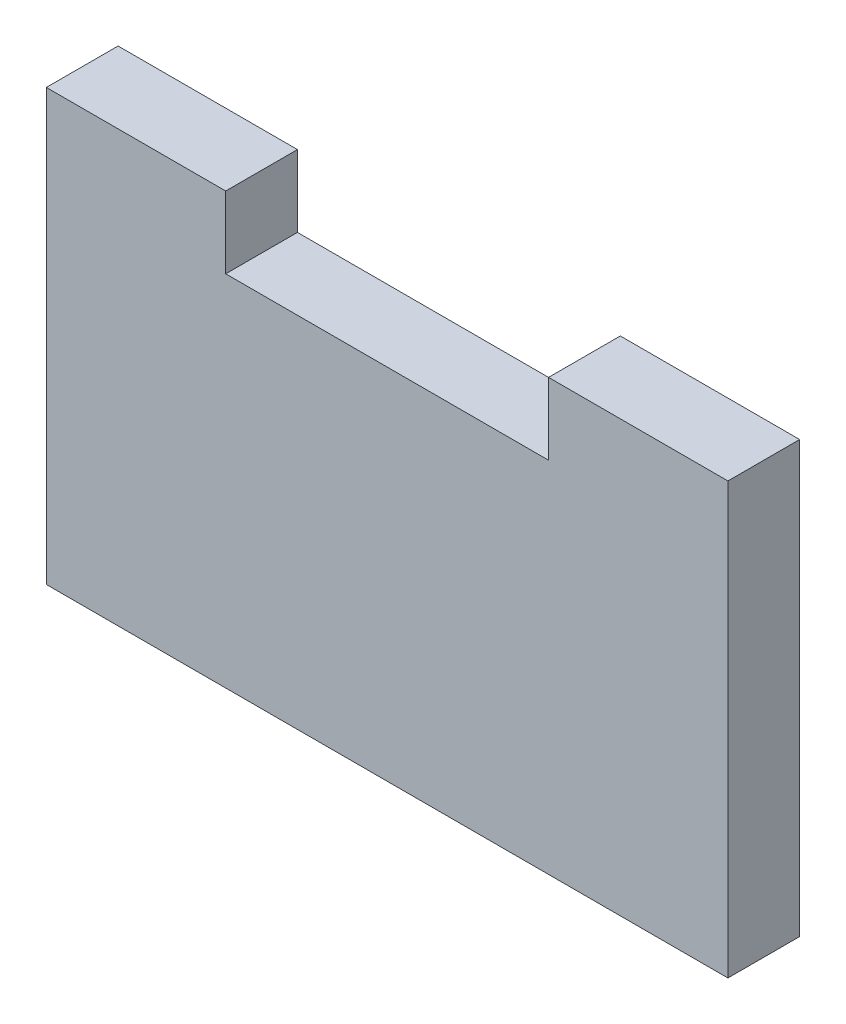
ISO-10303-21;
HEADER;
FILE_DESCRIPTION(('STEP AP214'),'2;1');
FILE_NAME('part.step','',(''),(''),'','','');
FILE_SCHEMA(('AUTOMOTIVE_DESIGN { 1 0 10303 214 1 1 1 1 }'));
ENDSEC;
DATA;
#1=APPLICATION_CONTEXT('core data for automotive mechanical design processes');
#2=APPLICATION_PROTOCOL_DEFINITION('international standard','automotive_design',2000,#1);
#3=PRODUCT_CONTEXT('',#1,'mechanical');
#4=PRODUCT('Part','Part','',(#3));
#5=PRODUCT_RELATED_PRODUCT_CATEGORY('part','',(#4));
#6=PRODUCT_DEFINITION_FORMATION('','',#4);
#7=PRODUCT_DEFINITION_CONTEXT('part definition',#1,'design');
#8=PRODUCT_DEFINITION('design','',#6,#7);
#9=PRODUCT_DEFINITION_SHAPE('','',#8);
#10=(LENGTH_UNIT() NAMED_UNIT(*) SI_UNIT(.MILLI.,.METRE.));
#11=(NAMED_UNIT(*) PLANE_ANGLE_UNIT() SI_UNIT($,.RADIAN.));
#12=(NAMED_UNIT(*) SI_UNIT($,.STERADIAN.) SOLID_ANGLE_UNIT());
#13=UNCERTAINTY_MEASURE_WITH_UNIT(LENGTH_MEASURE(1.E-05),#10,'distance_accuracy_value','');
#14=(GEOMETRIC_REPRESENTATION_CONTEXT(3) GLOBAL_UNCERTAINTY_ASSIGNED_CONTEXT((#13)) GLOBAL_UNIT_ASSIGNED_CONTEXT((#10,
#11,#12)) REPRESENTATION_CONTEXT('',''));
#15=CARTESIAN_POINT('',(0.,0.,0.));
#16=DIRECTION('',(0.,0.,1.));
#17=DIRECTION('',(1.,0.,0.));
#18=AXIS2_PLACEMENT_3D('',#15,#16,#17);
#19=CARTESIAN_POINT('',(9.,14.,4.));
#20=DIRECTION('',(0.,-1.,0.));
#21=DIRECTION('',(0.,0.,-1.));
#22=AXIS2_PLACEMENT_3D('',#19,#20,#21);
#23=PLANE('',#22);
#24=DIRECTION('',(-1.,0.,0.));
#25=VECTOR('',#24,1.);
#26=CARTESIAN_POINT('',(9.,14.,0.));
#27=LINE('',#26,#25);
#28=CARTESIAN_POINT('',(19.,14.,0.));
#29=VERTEX_POINT('',#28);
#30=CARTESIAN_POINT('',(9.,14.,0.));
#31=VERTEX_POINT('',#30);
#32=EDGE_CURVE('E133',#29,#31,#27,.T.);
#33=ORIENTED_EDGE('',*,*,#32,.T.);
#34=DIRECTION('',(0.,0.,-1.));
#35=VECTOR('',#34,1.);
#36=CARTESIAN_POINT('',(9.,14.,4.));
#37=LINE('',#36,#35);
#38=CARTESIAN_POINT('',(9.,14.,4.));
#39=VERTEX_POINT('',#38);
#40=EDGE_CURVE('E41',#39,#31,#37,.T.);
#41=ORIENTED_EDGE('',*,*,#40,.F.);
#42=DIRECTION('',(-1.,0.,0.));
#43=VECTOR('',#42,1.);
#44=CARTESIAN_POINT('',(9.,14.,4.));
#45=LINE('',#44,#43);
#46=CARTESIAN_POINT('',(19.,14.,4.));
#47=VERTEX_POINT('',#46);
#48=EDGE_CURVE('E92',#47,#39,#45,.T.);
#49=ORIENTED_EDGE('',*,*,#48,.F.);
#50=DIRECTION('',(0.,0.,-1.));
#51=VECTOR('',#50,1.);
#52=CARTESIAN_POINT('',(19.,14.,4.));
#53=LINE('',#52,#51);
#54=EDGE_CURVE('E11',#47,#29,#53,.T.);
#55=ORIENTED_EDGE('',*,*,#54,.T.);
#56=EDGE_LOOP('',(#33,#41,#49,#55));
#57=FACE_BOUND('',#56,.T.);
#58=ADVANCED_FACE('F33',(#57),#23,.F.);
#59=CARTESIAN_POINT('',(9.,10.,4.));
#60=DIRECTION('',(1.,0.,0.));
#61=DIRECTION('',(0.,0.,-1.));
#62=AXIS2_PLACEMENT_3D('',#59,#60,#61);
#63=PLANE('',#62);
#64=DIRECTION('',(0.,-1.,0.));
#65=VECTOR('',#64,1.);
#66=CARTESIAN_POINT('',(9.,10.,0.));
#67=LINE('',#66,#65);
#68=CARTESIAN_POINT('',(9.,10.,0.));
#69=VERTEX_POINT('',#68);
#70=EDGE_CURVE('E135',#31,#69,#67,.T.);
#71=ORIENTED_EDGE('',*,*,#70,.T.);
#72=DIRECTION('',(0.,0.,-1.));
#73=VECTOR('',#72,1.);
#74=CARTESIAN_POINT('',(9.,10.,4.));
#75=LINE('',#74,#73);
#76=CARTESIAN_POINT('',(9.,10.,4.));
#77=VERTEX_POINT('',#76);
#78=EDGE_CURVE('E152',#77,#69,#75,.T.);
#79=ORIENTED_EDGE('',*,*,#78,.F.);
#80=DIRECTION('',(0.,-1.,0.));
#81=VECTOR('',#80,1.);
#82=CARTESIAN_POINT('',(9.,10.,4.));
#83=LINE('',#82,#81);
#84=EDGE_CURVE('E160',#39,#77,#83,.T.);
#85=ORIENTED_EDGE('',*,*,#84,.F.);
#86=ORIENTED_EDGE('',*,*,#40,.T.);
#87=EDGE_LOOP('',(#71,#79,#85,#86));
#88=FACE_BOUND('',#87,.T.);
#89=ADVANCED_FACE('F158',(#88),#63,.F.);
#90=CARTESIAN_POINT('',(-9.,10.,4.));
#91=DIRECTION('',(0.,-1.,0.));
#92=DIRECTION('',(0.,0.,-1.));
#93=AXIS2_PLACEMENT_3D('',#90,#91,#92);
#94=PLANE('',#93);
#95=DIRECTION('',(-1.,0.,0.));
#96=VECTOR('',#95,1.);
#97=CARTESIAN_POINT('',(-9.,10.,0.));
#98=LINE('',#97,#96);
#99=CARTESIAN_POINT('',(-9.,10.,0.));
#100=VERTEX_POINT('',#99);
#101=EDGE_CURVE('E137',#69,#100,#98,.T.);
#102=ORIENTED_EDGE('',*,*,#101,.T.);
#103=DIRECTION('',(0.,0.,-1.));
#104=VECTOR('',#103,1.);
#105=CARTESIAN_POINT('',(-9.,10.,4.));
#106=LINE('',#105,#104);
#107=CARTESIAN_POINT('',(-9.,10.,4.));
#108=VERTEX_POINT('',#107);
#109=EDGE_CURVE('E149',#108,#100,#106,.T.);
#110=ORIENTED_EDGE('',*,*,#109,.F.);
#111=DIRECTION('',(-1.,0.,0.));
#112=VECTOR('',#111,1.);
#113=CARTESIAN_POINT('',(-9.,10.,4.));
#114=LINE('',#113,#112);
#115=EDGE_CURVE('E173',#77,#108,#114,.T.);
#116=ORIENTED_EDGE('',*,*,#115,.F.);
#117=ORIENTED_EDGE('',*,*,#78,.T.);
#118=EDGE_LOOP('',(#102,#110,#116,#117));
#119=FACE_BOUND('',#118,.T.);
#120=ADVANCED_FACE('F169',(#119),#94,.F.);
#121=CARTESIAN_POINT('',(-9.,14.,4.));
#122=DIRECTION('',(-1.,0.,0.));
#123=DIRECTION('',(0.,0.,1.));
#124=AXIS2_PLACEMENT_3D('',#121,#122,#123);
#125=PLANE('',#124);
#126=DIRECTION('',(0.,1.,0.));
#127=VECTOR('',#126,1.);
#128=CARTESIAN_POINT('',(-9.,14.,0.));
#129=LINE('',#128,#127);
#130=CARTESIAN_POINT('',(-9.,14.,0.));
#131=VERTEX_POINT('',#130);
#132=EDGE_CURVE('E139',#100,#131,#129,.T.);
#133=ORIENTED_EDGE('',*,*,#132,.T.);
#134=DIRECTION('',(0.,0.,-1.));
#135=VECTOR('',#134,1.);
#136=CARTESIAN_POINT('',(-9.,14.,4.));
#137=LINE('',#136,#135);
#138=CARTESIAN_POINT('',(-9.,14.,4.));
#139=VERTEX_POINT('',#138);
#140=EDGE_CURVE('E122',#139,#131,#137,.T.);
#141=ORIENTED_EDGE('',*,*,#140,.F.);
#142=DIRECTION('',(0.,1.,0.));
#143=VECTOR('',#142,1.);
#144=CARTESIAN_POINT('',(-9.,14.,4.));
#145=LINE('',#144,#143);
#146=EDGE_CURVE('E112',#108,#139,#145,.T.);
#147=ORIENTED_EDGE('',*,*,#146,.F.);
#148=ORIENTED_EDGE('',*,*,#109,.T.);
#149=EDGE_LOOP('',(#133,#141,#147,#148));
#150=FACE_BOUND('',#149,.T.);
#151=ADVANCED_FACE('F172',(#150),#125,.F.);
#152=CARTESIAN_POINT('',(-19.,14.,4.));
#153=DIRECTION('',(0.,-1.,0.));
#154=DIRECTION('',(0.,0.,-1.));
#155=AXIS2_PLACEMENT_3D('',#152,#153,#154);
#156=PLANE('',#155);
#157=DIRECTION('',(-1.,0.,0.));
#158=VECTOR('',#157,1.);
#159=CARTESIAN_POINT('',(-19.,14.,0.));
#160=LINE('',#159,#158);
#161=CARTESIAN_POINT('',(-19.,14.,0.));
#162=VERTEX_POINT('',#161);
#163=EDGE_CURVE('E121',#131,#162,#160,.T.);
#164=ORIENTED_EDGE('',*,*,#163,.T.);
#165=DIRECTION('',(0.,0.,-1.));
#166=VECTOR('',#165,1.);
#167=CARTESIAN_POINT('',(-19.,14.,4.));
#168=LINE('',#167,#166);
#169=CARTESIAN_POINT('',(-19.,14.,4.));
#170=VERTEX_POINT('',#169);
#171=EDGE_CURVE('E118',#170,#162,#168,.T.);
#172=ORIENTED_EDGE('',*,*,#171,.F.);
#173=DIRECTION('',(-1.,0.,0.));
#174=VECTOR('',#173,1.);
#175=CARTESIAN_POINT('',(-19.,14.,4.));
#176=LINE('',#175,#174);
#177=EDGE_CURVE('E106',#139,#170,#176,.T.);
#178=ORIENTED_EDGE('',*,*,#177,.F.);
#179=ORIENTED_EDGE('',*,*,#140,.T.);
#180=EDGE_LOOP('',(#164,#172,#178,#179));
#181=FACE_BOUND('',#180,.T.);
#182=ADVANCED_FACE('F119',(#181),#156,.F.);
#183=CARTESIAN_POINT('',(-19.,-10.,4.));
#184=DIRECTION('',(1.,0.,0.));
#185=DIRECTION('',(0.,0.,-1.));
#186=AXIS2_PLACEMENT_3D('',#183,#184,#185);
#187=PLANE('',#186);
#188=DIRECTION('',(0.,-1.,0.));
#189=VECTOR('',#188,1.);
#190=CARTESIAN_POINT('',(-19.,-10.,0.));
#191=LINE('',#190,#189);
#192=CARTESIAN_POINT('',(-19.,-10.,0.));
#193=VERTEX_POINT('',#192);
#194=EDGE_CURVE('E78',#162,#193,#191,.T.);
#195=ORIENTED_EDGE('',*,*,#194,.T.);
#196=DIRECTION('',(0.,0.,-1.));
#197=VECTOR('',#196,1.);
#198=CARTESIAN_POINT('',(-19.,-10.,4.));
#199=LINE('',#198,#197);
#200=CARTESIAN_POINT('',(-19.,-10.,4.));
#201=VERTEX_POINT('',#200);
#202=EDGE_CURVE('E123',#201,#193,#199,.T.);
#203=ORIENTED_EDGE('',*,*,#202,.F.);
#204=DIRECTION('',(0.,-1.,0.));
#205=VECTOR('',#204,1.);
#206=CARTESIAN_POINT('',(-19.,10.,4.));
#207=LINE('',#206,#205);
#208=EDGE_CURVE('E110',#170,#201,#207,.T.);
#209=ORIENTED_EDGE('',*,*,#208,.F.);
#210=ORIENTED_EDGE('',*,*,#171,.T.);
#211=EDGE_LOOP('',(#195,#203,#209,#210));
#212=FACE_BOUND('',#211,.T.);
#213=ADVANCED_FACE('F125',(#212),#187,.F.);
#214=CARTESIAN_POINT('',(-19.,-10.,4.));
#215=DIRECTION('',(0.,1.,0.));
#216=DIRECTION('',(0.,0.,1.));
#217=AXIS2_PLACEMENT_3D('',#214,#215,#216);
#218=PLANE('',#217);
#219=DIRECTION('',(1.,0.,0.));
#220=VECTOR('',#219,1.);
#221=CARTESIAN_POINT('',(-19.,-10.,0.));
#222=LINE('',#221,#220);
#223=CARTESIAN_POINT('',(19.,-10.,0.));
#224=VERTEX_POINT('',#223);
#225=EDGE_CURVE('E85',#193,#224,#222,.T.);
#226=ORIENTED_EDGE('',*,*,#225,.T.);
#227=DIRECTION('',(0.,0.,-1.));
#228=VECTOR('',#227,1.);
#229=CARTESIAN_POINT('',(19.,-10.,4.));
#230=LINE('',#229,#228);
#231=CARTESIAN_POINT('',(19.,-10.,4.));
#232=VERTEX_POINT('',#231);
#233=EDGE_CURVE('E129',#232,#224,#230,.T.);
#234=ORIENTED_EDGE('',*,*,#233,.F.);
#235=DIRECTION('',(1.,0.,0.));
#236=VECTOR('',#235,1.);
#237=CARTESIAN_POINT('',(-19.,-10.,4.));
#238=LINE('',#237,#236);
#239=EDGE_CURVE('E127',#201,#232,#238,.T.);
#240=ORIENTED_EDGE('',*,*,#239,.F.);
#241=ORIENTED_EDGE('',*,*,#202,.T.);
#242=EDGE_LOOP('',(#226,#234,#240,#241));
#243=FACE_BOUND('',#242,.T.);
#244=ADVANCED_FACE('F194',(#243),#218,.F.);
#245=CARTESIAN_POINT('',(19.,-10.,4.));
#246=DIRECTION('',(-1.,0.,0.));
#247=DIRECTION('',(0.,0.,1.));
#248=AXIS2_PLACEMENT_3D('',#245,#246,#247);
#249=PLANE('',#248);
#250=DIRECTION('',(0.,1.,0.));
#251=VECTOR('',#250,1.);
#252=CARTESIAN_POINT('',(19.,-10.,0.));
#253=LINE('',#252,#251);
#254=EDGE_CURVE('E144',#224,#29,#253,.T.);
#255=ORIENTED_EDGE('',*,*,#254,.T.);
#256=ORIENTED_EDGE('',*,*,#54,.F.);
#257=DIRECTION('',(0.,1.,0.));
#258=VECTOR('',#257,1.);
#259=CARTESIAN_POINT('',(19.,14.,4.));
#260=LINE('',#259,#258);
#261=EDGE_CURVE('E49',#232,#47,#260,.T.);
#262=ORIENTED_EDGE('',*,*,#261,.F.);
#263=ORIENTED_EDGE('',*,*,#233,.T.);
#264=EDGE_LOOP('',(#255,#256,#262,#263));
#265=FACE_BOUND('',#264,.T.);
#266=ADVANCED_FACE('F178',(#265),#249,.F.);
#267=CARTESIAN_POINT('',(0.,0.,4.));
#268=DIRECTION('',(0.,0.,1.));
#269=DIRECTION('',(1.,0.,0.));
#270=AXIS2_PLACEMENT_3D('',#267,#268,#269);
#271=PLANE('',#270);
#272=ORIENTED_EDGE('',*,*,#261,.T.);
#273=ORIENTED_EDGE('',*,*,#48,.T.);
#274=ORIENTED_EDGE('',*,*,#84,.T.);
#275=ORIENTED_EDGE('',*,*,#115,.T.);
#276=ORIENTED_EDGE('',*,*,#146,.T.);
#277=ORIENTED_EDGE('',*,*,#177,.T.);
#278=ORIENTED_EDGE('',*,*,#208,.T.);
#279=ORIENTED_EDGE('',*,*,#239,.T.);
#280=EDGE_LOOP('',(#272,#273,#274,#275,#276,#277,#278,#279));
#281=FACE_BOUND('',#280,.T.);
#282=ADVANCED_FACE('F108',(#281),#271,.T.);
#283=CARTESIAN_POINT('',(0.,0.,0.));
#284=DIRECTION('',(0.,0.,1.));
#285=DIRECTION('',(1.,0.,0.));
#286=AXIS2_PLACEMENT_3D('',#283,#284,#285);
#287=PLANE('',#286);
#288=ORIENTED_EDGE('',*,*,#32,.F.);
#289=ORIENTED_EDGE('',*,*,#254,.F.);
#290=ORIENTED_EDGE('',*,*,#225,.F.);
#291=ORIENTED_EDGE('',*,*,#194,.F.);
#292=ORIENTED_EDGE('',*,*,#163,.F.);
#293=ORIENTED_EDGE('',*,*,#132,.F.);
#294=ORIENTED_EDGE('',*,*,#101,.F.);
#295=ORIENTED_EDGE('',*,*,#70,.F.);
#296=EDGE_LOOP('',(#288,#289,#290,#291,#292,#293,#294,#295));
#297=FACE_BOUND('',#296,.T.);
#298=ADVANCED_FACE('F164',(#297),#287,.F.);
#299=CLOSED_SHELL('',(#58,#89,#120,#151,#182,#213,#244,#266,#282,#298));
#300=MANIFOLD_SOLID_BREP('B2',#299);
#301=ADVANCED_BREP_SHAPE_REPRESENTATION('',(#18,#300),#14);
#302=SHAPE_DEFINITION_REPRESENTATION(#9,#301);
ENDSEC;
END-ISO-10303-21;
